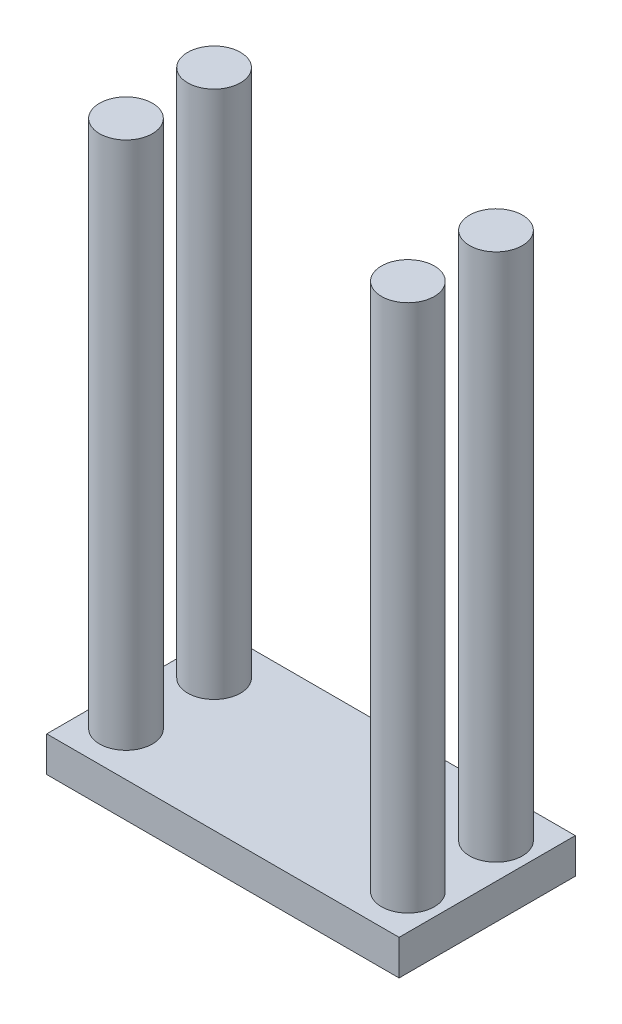
ISO-10303-21;
HEADER;
FILE_DESCRIPTION(('STEP AP214'),'2;1');
FILE_NAME('part.step','',(''),(''),'','','');
FILE_SCHEMA(('AUTOMOTIVE_DESIGN { 1 0 10303 214 1 1 1 1 }'));
ENDSEC;
DATA;
#1=APPLICATION_CONTEXT('core data for automotive mechanical design processes');
#2=APPLICATION_PROTOCOL_DEFINITION('international standard','automotive_design',2000,#1);
#3=PRODUCT_CONTEXT('',#1,'mechanical');
#4=PRODUCT('Part','Part','',(#3));
#5=PRODUCT_RELATED_PRODUCT_CATEGORY('part','',(#4));
#6=PRODUCT_DEFINITION_FORMATION('','',#4);
#7=PRODUCT_DEFINITION_CONTEXT('part definition',#1,'design');
#8=PRODUCT_DEFINITION('design','',#6,#7);
#9=PRODUCT_DEFINITION_SHAPE('','',#8);
#10=(LENGTH_UNIT() NAMED_UNIT(*) SI_UNIT(.MILLI.,.METRE.));
#11=(NAMED_UNIT(*) PLANE_ANGLE_UNIT() SI_UNIT($,.RADIAN.));
#12=(NAMED_UNIT(*) SI_UNIT($,.STERADIAN.) SOLID_ANGLE_UNIT());
#13=UNCERTAINTY_MEASURE_WITH_UNIT(LENGTH_MEASURE(1.E-05),#10,'distance_accuracy_value','');
#14=(GEOMETRIC_REPRESENTATION_CONTEXT(3) GLOBAL_UNCERTAINTY_ASSIGNED_CONTEXT((#13)) GLOBAL_UNIT_ASSIGNED_CONTEXT((#10,
#11,#12)) REPRESENTATION_CONTEXT('',''));
#15=CARTESIAN_POINT('',(0.,0.,0.));
#16=DIRECTION('',(0.,0.,1.));
#17=DIRECTION('',(1.,0.,0.));
#18=AXIS2_PLACEMENT_3D('',#15,#16,#17);
#19=CARTESIAN_POINT('',(10.,-2.,-2.5));
#20=DIRECTION('',(1.,0.,0.));
#21=DIRECTION('',(0.,0.,-1.));
#22=AXIS2_PLACEMENT_3D('',#19,#20,#21);
#23=PLANE('',#22);
#24=DIRECTION('',(0.,0.,-1.));
#25=VECTOR('',#24,1.);
#26=CARTESIAN_POINT('',(10.,0.,-2.5));
#27=LINE('',#26,#25);
#28=CARTESIAN_POINT('',(10.,0.,2.5));
#29=VERTEX_POINT('',#28);
#30=CARTESIAN_POINT('',(10.,0.,-7.5));
#31=VERTEX_POINT('',#30);
#32=EDGE_CURVE('E73',#29,#31,#27,.T.);
#33=ORIENTED_EDGE('',*,*,#32,.F.);
#34=DIRECTION('',(0.,1.,0.));
#35=VECTOR('',#34,1.);
#36=CARTESIAN_POINT('',(10.,-2.,2.5));
#37=LINE('',#36,#35);
#38=CARTESIAN_POINT('',(10.,-2.,2.5));
#39=VERTEX_POINT('',#38);
#40=EDGE_CURVE('E11',#39,#29,#37,.T.);
#41=ORIENTED_EDGE('',*,*,#40,.F.);
#42=DIRECTION('',(0.,0.,-1.));
#43=VECTOR('',#42,1.);
#44=CARTESIAN_POINT('',(10.,-2.,-2.5));
#45=LINE('',#44,#43);
#46=CARTESIAN_POINT('',(10.,-2.,-7.5));
#47=VERTEX_POINT('',#46);
#48=EDGE_CURVE('E62',#39,#47,#45,.T.);
#49=ORIENTED_EDGE('',*,*,#48,.T.);
#50=DIRECTION('',(0.,1.,0.));
#51=VECTOR('',#50,1.);
#52=CARTESIAN_POINT('',(10.,-2.,-7.5));
#53=LINE('',#52,#51);
#54=EDGE_CURVE('E88',#47,#31,#53,.T.);
#55=ORIENTED_EDGE('',*,*,#54,.T.);
#56=EDGE_LOOP('',(#33,#41,#49,#55));
#57=FACE_BOUND('',#56,.T.);
#58=ADVANCED_FACE('F33',(#57),#23,.T.);
#59=CARTESIAN_POINT('',(-10.,-2.,2.5));
#60=DIRECTION('',(0.,0.,1.));
#61=DIRECTION('',(1.,0.,0.));
#62=AXIS2_PLACEMENT_3D('',#59,#60,#61);
#63=PLANE('',#62);
#64=DIRECTION('',(1.,0.,0.));
#65=VECTOR('',#64,1.);
#66=CARTESIAN_POINT('',(-10.,0.,2.5));
#67=LINE('',#66,#65);
#68=CARTESIAN_POINT('',(-10.,0.,2.5));
#69=VERTEX_POINT('',#68);
#70=EDGE_CURVE('E79',#69,#29,#67,.T.);
#71=ORIENTED_EDGE('',*,*,#70,.F.);
#72=DIRECTION('',(0.,1.,0.));
#73=VECTOR('',#72,1.);
#74=CARTESIAN_POINT('',(-10.,-2.,2.5));
#75=LINE('',#74,#73);
#76=CARTESIAN_POINT('',(-10.,-2.,2.5));
#77=VERTEX_POINT('',#76);
#78=EDGE_CURVE('E36',#77,#69,#75,.T.);
#79=ORIENTED_EDGE('',*,*,#78,.F.);
#80=DIRECTION('',(1.,0.,0.));
#81=VECTOR('',#80,1.);
#82=CARTESIAN_POINT('',(-10.,-2.,2.5));
#83=LINE('',#82,#81);
#84=EDGE_CURVE('E112',#77,#39,#83,.T.);
#85=ORIENTED_EDGE('',*,*,#84,.T.);
#86=ORIENTED_EDGE('',*,*,#40,.T.);
#87=EDGE_LOOP('',(#71,#79,#85,#86));
#88=FACE_BOUND('',#87,.T.);
#89=ADVANCED_FACE('F117',(#88),#63,.T.);
#90=CARTESIAN_POINT('',(-10.,-2.,-2.5));
#91=DIRECTION('',(-1.,0.,0.));
#92=DIRECTION('',(0.,0.,1.));
#93=AXIS2_PLACEMENT_3D('',#90,#91,#92);
#94=PLANE('',#93);
#95=DIRECTION('',(0.,0.,1.));
#96=VECTOR('',#95,1.);
#97=CARTESIAN_POINT('',(-10.,0.,-2.5));
#98=LINE('',#97,#96);
#99=CARTESIAN_POINT('',(-10.,0.,-7.5));
#100=VERTEX_POINT('',#99);
#101=EDGE_CURVE('E80',#100,#69,#98,.T.);
#102=ORIENTED_EDGE('',*,*,#101,.F.);
#103=DIRECTION('',(0.,1.,0.));
#104=VECTOR('',#103,1.);
#105=CARTESIAN_POINT('',(-10.,-2.,-7.5));
#106=LINE('',#105,#104);
#107=CARTESIAN_POINT('',(-10.,-2.,-7.5));
#108=VERTEX_POINT('',#107);
#109=EDGE_CURVE('E90',#108,#100,#106,.T.);
#110=ORIENTED_EDGE('',*,*,#109,.F.);
#111=DIRECTION('',(0.,0.,1.));
#112=VECTOR('',#111,1.);
#113=CARTESIAN_POINT('',(-10.,-2.,-2.5));
#114=LINE('',#113,#112);
#115=EDGE_CURVE('E110',#108,#77,#114,.T.);
#116=ORIENTED_EDGE('',*,*,#115,.T.);
#117=ORIENTED_EDGE('',*,*,#78,.T.);
#118=EDGE_LOOP('',(#102,#110,#116,#117));
#119=FACE_BOUND('',#118,.T.);
#120=ADVANCED_FACE('F149',(#119),#94,.T.);
#121=CARTESIAN_POINT('',(0.,-2.,0.));
#122=DIRECTION('',(0.,1.,0.));
#123=DIRECTION('',(0.,0.,1.));
#124=AXIS2_PLACEMENT_3D('',#121,#122,#123);
#125=PLANE('',#124);
#126=ORIENTED_EDGE('',*,*,#48,.F.);
#127=ORIENTED_EDGE('',*,*,#84,.F.);
#128=ORIENTED_EDGE('',*,*,#115,.F.);
#129=DIRECTION('',(1.,0.,0.));
#130=VECTOR('',#129,1.);
#131=CARTESIAN_POINT('',(-10.,-2.,-7.5));
#132=LINE('',#131,#130);
#133=EDGE_CURVE('E91',#108,#47,#132,.T.);
#134=ORIENTED_EDGE('',*,*,#133,.T.);
#135=EDGE_LOOP('',(#126,#127,#128,#134));
#136=FACE_BOUND('',#135,.T.);
#137=ADVANCED_FACE('F120',(#136),#125,.F.);
#138=CARTESIAN_POINT('',(0.,0.,0.));
#139=DIRECTION('',(0.,1.,0.));
#140=DIRECTION('',(0.,0.,1.));
#141=AXIS2_PLACEMENT_3D('',#138,#139,#140);
#142=PLANE('',#141);
#143=CARTESIAN_POINT('',(8.,0.,0.));
#144=DIRECTION('',(0.,1.,0.));
#145=DIRECTION('',(0.,0.,-1.));
#146=AXIS2_PLACEMENT_3D('',#143,#144,#145);
#147=CIRCLE('',#146,1.5);
#148=CARTESIAN_POINT('',(8.,0.,-1.5));
#149=VERTEX_POINT('',#148);
#150=EDGE_CURVE('E94',#149,#149,#147,.T.);
#151=ORIENTED_EDGE('',*,*,#150,.F.);
#152=EDGE_LOOP('',(#151));
#153=FACE_BOUND('',#152,.T.);
#154=CARTESIAN_POINT('',(-8.,0.,0.));
#155=DIRECTION('',(0.,1.,0.));
#156=DIRECTION('',(0.,0.,1.));
#157=AXIS2_PLACEMENT_3D('',#154,#155,#156);
#158=CIRCLE('',#157,1.5);
#159=CARTESIAN_POINT('',(-8.,0.,1.5));
#160=VERTEX_POINT('',#159);
#161=EDGE_CURVE('E103',#160,#160,#158,.T.);
#162=ORIENTED_EDGE('',*,*,#161,.F.);
#163=EDGE_LOOP('',(#162));
#164=FACE_BOUND('',#163,.T.);
#165=ORIENTED_EDGE('',*,*,#32,.T.);
#166=DIRECTION('',(1.,0.,0.));
#167=VECTOR('',#166,1.);
#168=CARTESIAN_POINT('',(-10.,0.,-7.5));
#169=LINE('',#168,#167);
#170=EDGE_CURVE('E77',#100,#31,#169,.T.);
#171=ORIENTED_EDGE('',*,*,#170,.F.);
#172=ORIENTED_EDGE('',*,*,#101,.T.);
#173=ORIENTED_EDGE('',*,*,#70,.T.);
#174=EDGE_LOOP('',(#165,#171,#172,#173));
#175=FACE_BOUND('',#174,.T.);
#176=CARTESIAN_POINT('',(8.,0.,-5.));
#177=DIRECTION('',(0.,-1.,0.));
#178=DIRECTION('',(0.,0.,1.));
#179=AXIS2_PLACEMENT_3D('',#176,#177,#178);
#180=CIRCLE('',#179,1.5);
#181=CARTESIAN_POINT('',(8.,0.,-3.5));
#182=VERTEX_POINT('',#181);
#183=EDGE_CURVE('E128',#182,#182,#180,.T.);
#184=ORIENTED_EDGE('',*,*,#183,.T.);
#185=EDGE_LOOP('',(#184));
#186=FACE_BOUND('',#185,.T.);
#187=CARTESIAN_POINT('',(-8.,0.,-5.));
#188=DIRECTION('',(0.,-1.,0.));
#189=DIRECTION('',(0.,0.,-1.));
#190=AXIS2_PLACEMENT_3D('',#187,#188,#189);
#191=CIRCLE('',#190,1.5);
#192=CARTESIAN_POINT('',(-8.,0.,-6.5));
#193=VERTEX_POINT('',#192);
#194=EDGE_CURVE('E122',#193,#193,#191,.T.);
#195=ORIENTED_EDGE('',*,*,#194,.T.);
#196=EDGE_LOOP('',(#195));
#197=FACE_BOUND('',#196,.T.);
#198=ADVANCED_FACE('F75',(#153,#164,#175,#186,#197),#142,.T.);
#199=CARTESIAN_POINT('',(-8.,30.,0.));
#200=DIRECTION('',(0.,-1.,0.));
#201=DIRECTION('',(0.,0.,-1.));
#202=AXIS2_PLACEMENT_3D('',#199,#200,#201);
#203=CYLINDRICAL_SURFACE('',#202,1.5);
#204=CARTESIAN_POINT('',(-8.,30.,0.));
#205=DIRECTION('',(0.,1.,0.));
#206=DIRECTION('',(0.,0.,1.));
#207=AXIS2_PLACEMENT_3D('',#204,#205,#206);
#208=CIRCLE('',#207,1.5);
#209=CARTESIAN_POINT('',(-8.,30.,1.5));
#210=VERTEX_POINT('',#209);
#211=EDGE_CURVE('E81',#210,#210,#208,.T.);
#212=ORIENTED_EDGE('',*,*,#211,.F.);
#213=EDGE_LOOP('',(#212));
#214=FACE_BOUND('',#213,.T.);
#215=ORIENTED_EDGE('',*,*,#161,.T.);
#216=EDGE_LOOP('',(#215));
#217=FACE_BOUND('',#216,.T.);
#218=ADVANCED_FACE('F157',(#214,#217),#203,.T.);
#219=CARTESIAN_POINT('',(-8.,30.,0.));
#220=DIRECTION('',(0.,1.,0.));
#221=DIRECTION('',(0.,0.,1.));
#222=AXIS2_PLACEMENT_3D('',#219,#220,#221);
#223=PLANE('',#222);
#224=ORIENTED_EDGE('',*,*,#211,.T.);
#225=EDGE_LOOP('',(#224));
#226=FACE_BOUND('',#225,.T.);
#227=ADVANCED_FACE('F163',(#226),#223,.T.);
#228=CARTESIAN_POINT('',(8.,30.,0.));
#229=DIRECTION('',(0.,-1.,0.));
#230=DIRECTION('',(0.,0.,-1.));
#231=AXIS2_PLACEMENT_3D('',#228,#229,#230);
#232=CYLINDRICAL_SURFACE('',#231,1.5);
#233=CARTESIAN_POINT('',(8.,30.,0.));
#234=DIRECTION('',(0.,1.,0.));
#235=DIRECTION('',(0.,0.,-1.));
#236=AXIS2_PLACEMENT_3D('',#233,#234,#235);
#237=CIRCLE('',#236,1.5);
#238=CARTESIAN_POINT('',(8.,30.,-1.5));
#239=VERTEX_POINT('',#238);
#240=EDGE_CURVE('E97',#239,#239,#237,.T.);
#241=ORIENTED_EDGE('',*,*,#240,.F.);
#242=EDGE_LOOP('',(#241));
#243=FACE_BOUND('',#242,.T.);
#244=ORIENTED_EDGE('',*,*,#150,.T.);
#245=EDGE_LOOP('',(#244));
#246=FACE_BOUND('',#245,.T.);
#247=ADVANCED_FACE('F167',(#243,#246),#232,.T.);
#248=CARTESIAN_POINT('',(8.,30.,0.));
#249=DIRECTION('',(0.,-1.,0.));
#250=DIRECTION('',(0.,0.,-1.));
#251=AXIS2_PLACEMENT_3D('',#248,#249,#250);
#252=PLANE('',#251);
#253=ORIENTED_EDGE('',*,*,#240,.T.);
#254=EDGE_LOOP('',(#253));
#255=FACE_BOUND('',#254,.T.);
#256=ADVANCED_FACE('F171',(#255),#252,.F.);
#257=CARTESIAN_POINT('',(-10.,-2.,-7.5));
#258=DIRECTION('',(0.,0.,-1.));
#259=DIRECTION('',(1.,0.,0.));
#260=AXIS2_PLACEMENT_3D('',#257,#258,#259);
#261=PLANE('',#260);
#262=ORIENTED_EDGE('',*,*,#170,.T.);
#263=ORIENTED_EDGE('',*,*,#54,.F.);
#264=ORIENTED_EDGE('',*,*,#133,.F.);
#265=ORIENTED_EDGE('',*,*,#109,.T.);
#266=EDGE_LOOP('',(#262,#263,#264,#265));
#267=FACE_BOUND('',#266,.T.);
#268=ADVANCED_FACE('F86',(#267),#261,.T.);
#269=CARTESIAN_POINT('',(-8.,30.,-5.));
#270=DIRECTION('',(0.,-1.,0.));
#271=DIRECTION('',(0.,0.,1.));
#272=AXIS2_PLACEMENT_3D('',#269,#270,#271);
#273=CYLINDRICAL_SURFACE('',#272,1.5);
#274=CARTESIAN_POINT('',(-8.,30.,-5.));
#275=DIRECTION('',(0.,-1.,0.));
#276=DIRECTION('',(0.,0.,-1.));
#277=AXIS2_PLACEMENT_3D('',#274,#275,#276);
#278=CIRCLE('',#277,1.5);
#279=CARTESIAN_POINT('',(-8.,30.,-6.5));
#280=VERTEX_POINT('',#279);
#281=EDGE_CURVE('E92',#280,#280,#278,.T.);
#282=ORIENTED_EDGE('',*,*,#281,.T.);
#283=EDGE_LOOP('',(#282));
#284=FACE_BOUND('',#283,.T.);
#285=ORIENTED_EDGE('',*,*,#194,.F.);
#286=EDGE_LOOP('',(#285));
#287=FACE_BOUND('',#286,.T.);
#288=ADVANCED_FACE('F178',(#284,#287),#273,.T.);
#289=CARTESIAN_POINT('',(-8.,30.,-5.));
#290=DIRECTION('',(0.,1.,0.));
#291=DIRECTION('',(0.,0.,-1.));
#292=AXIS2_PLACEMENT_3D('',#289,#290,#291);
#293=PLANE('',#292);
#294=ORIENTED_EDGE('',*,*,#281,.F.);
#295=EDGE_LOOP('',(#294));
#296=FACE_BOUND('',#295,.T.);
#297=ADVANCED_FACE('F143',(#296),#293,.T.);
#298=CARTESIAN_POINT('',(8.,30.,-5.));
#299=DIRECTION('',(0.,-1.,0.));
#300=DIRECTION('',(0.,0.,1.));
#301=AXIS2_PLACEMENT_3D('',#298,#299,#300);
#302=CYLINDRICAL_SURFACE('',#301,1.5);
#303=CARTESIAN_POINT('',(8.,30.,-5.));
#304=DIRECTION('',(0.,-1.,0.));
#305=DIRECTION('',(0.,0.,1.));
#306=AXIS2_PLACEMENT_3D('',#303,#304,#305);
#307=CIRCLE('',#306,1.5);
#308=CARTESIAN_POINT('',(8.,30.,-3.5));
#309=VERTEX_POINT('',#308);
#310=EDGE_CURVE('E125',#309,#309,#307,.T.);
#311=ORIENTED_EDGE('',*,*,#310,.T.);
#312=EDGE_LOOP('',(#311));
#313=FACE_BOUND('',#312,.T.);
#314=ORIENTED_EDGE('',*,*,#183,.F.);
#315=EDGE_LOOP('',(#314));
#316=FACE_BOUND('',#315,.T.);
#317=ADVANCED_FACE('F134',(#313,#316),#302,.T.);
#318=CARTESIAN_POINT('',(8.,30.,-5.));
#319=DIRECTION('',(0.,-1.,0.));
#320=DIRECTION('',(0.,0.,1.));
#321=AXIS2_PLACEMENT_3D('',#318,#319,#320);
#322=PLANE('',#321);
#323=ORIENTED_EDGE('',*,*,#310,.F.);
#324=EDGE_LOOP('',(#323));
#325=FACE_BOUND('',#324,.T.);
#326=ADVANCED_FACE('F137',(#325),#322,.F.);
#327=CLOSED_SHELL('',(#58,#89,#120,#137,#198,#218,#227,#247,#256,#268,#288,#297,#317,#326));
#328=MANIFOLD_SOLID_BREP('B2',#327);
#329=ADVANCED_BREP_SHAPE_REPRESENTATION('',(#18,#328),#14);
#330=SHAPE_DEFINITION_REPRESENTATION(#9,#329);
ENDSEC;
END-ISO-10303-21;
